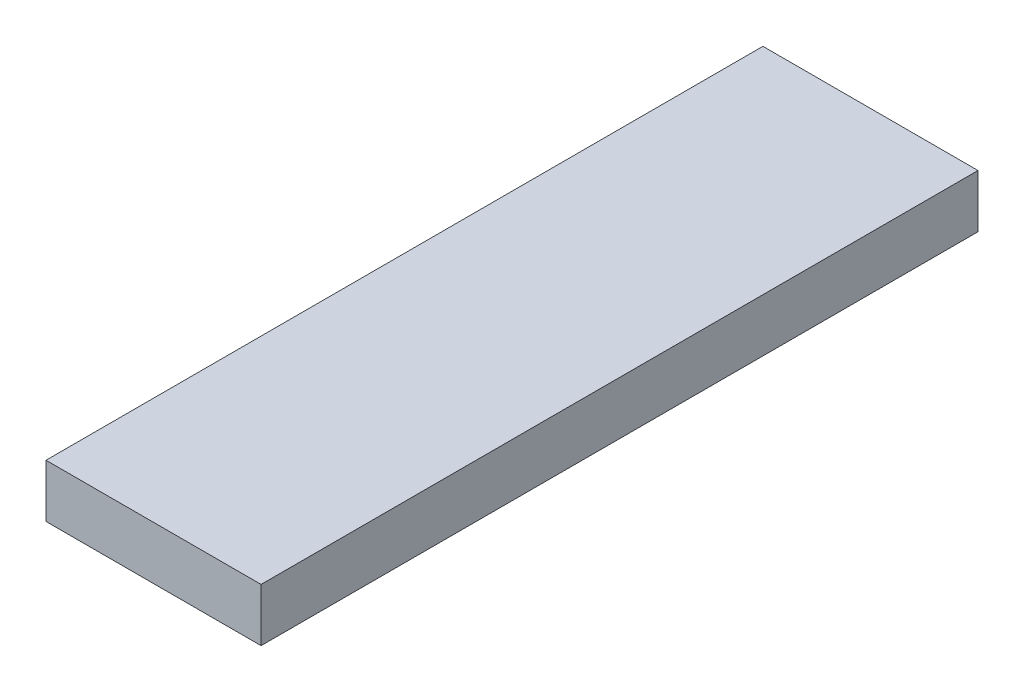
ISO-10303-21;
HEADER;
FILE_DESCRIPTION(('STEP AP214'),'2;1');
FILE_NAME('part.step','',(''),(''),'','','');
FILE_SCHEMA(('AUTOMOTIVE_DESIGN { 1 0 10303 214 1 1 1 1 }'));
ENDSEC;
DATA;
#1=APPLICATION_CONTEXT('core data for automotive mechanical design processes');
#2=APPLICATION_PROTOCOL_DEFINITION('international standard','automotive_design',2000,#1);
#3=PRODUCT_CONTEXT('',#1,'mechanical');
#4=PRODUCT('Part','Part','',(#3));
#5=PRODUCT_RELATED_PRODUCT_CATEGORY('part','',(#4));
#6=PRODUCT_DEFINITION_FORMATION('','',#4);
#7=PRODUCT_DEFINITION_CONTEXT('part definition',#1,'design');
#8=PRODUCT_DEFINITION('design','',#6,#7);
#9=PRODUCT_DEFINITION_SHAPE('','',#8);
#10=(LENGTH_UNIT() NAMED_UNIT(*) SI_UNIT(.MILLI.,.METRE.));
#11=(NAMED_UNIT(*) PLANE_ANGLE_UNIT() SI_UNIT($,.RADIAN.));
#12=(NAMED_UNIT(*) SI_UNIT($,.STERADIAN.) SOLID_ANGLE_UNIT());
#13=UNCERTAINTY_MEASURE_WITH_UNIT(LENGTH_MEASURE(1.E-05),#10,'distance_accuracy_value','');
#14=(GEOMETRIC_REPRESENTATION_CONTEXT(3) GLOBAL_UNCERTAINTY_ASSIGNED_CONTEXT((#13)) GLOBAL_UNIT_ASSIGNED_CONTEXT((#10,
#11,#12)) REPRESENTATION_CONTEXT('',''));
#15=CARTESIAN_POINT('',(0.,0.,0.));
#16=DIRECTION('',(0.,0.,1.));
#17=DIRECTION('',(1.,0.,0.));
#18=AXIS2_PLACEMENT_3D('',#15,#16,#17);
#19=CARTESIAN_POINT('',(0.,4.699,-63.5));
#20=DIRECTION('',(1.,0.,0.));
#21=DIRECTION('',(0.,0.,-1.));
#22=AXIS2_PLACEMENT_3D('',#19,#20,#21);
#23=PLANE('',#22);
#24=DIRECTION('',(0.,0.,1.));
#25=VECTOR('',#24,1.);
#26=CARTESIAN_POINT('',(0.,0.,-63.5));
#27=LINE('',#26,#25);
#28=CARTESIAN_POINT('',(0.,0.,-63.5));
#29=VERTEX_POINT('',#28);
#30=CARTESIAN_POINT('',(0.,0.,0.));
#31=VERTEX_POINT('',#30);
#32=EDGE_CURVE('E96',#29,#31,#27,.T.);
#33=ORIENTED_EDGE('',*,*,#32,.T.);
#34=DIRECTION('',(0.,-1.,0.));
#35=VECTOR('',#34,1.);
#36=CARTESIAN_POINT('',(0.,4.699,0.));
#37=LINE('',#36,#35);
#38=CARTESIAN_POINT('',(0.,4.699,0.));
#39=VERTEX_POINT('',#38);
#40=EDGE_CURVE('E11',#39,#31,#37,.T.);
#41=ORIENTED_EDGE('',*,*,#40,.F.);
#42=DIRECTION('',(0.,0.,1.));
#43=VECTOR('',#42,1.);
#44=CARTESIAN_POINT('',(0.,4.699,-63.5));
#45=LINE('',#44,#43);
#46=CARTESIAN_POINT('',(0.,4.699,-63.5));
#47=VERTEX_POINT('',#46);
#48=EDGE_CURVE('E84',#47,#39,#45,.T.);
#49=ORIENTED_EDGE('',*,*,#48,.F.);
#50=DIRECTION('',(0.,-1.,0.));
#51=VECTOR('',#50,1.);
#52=CARTESIAN_POINT('',(0.,4.699,-63.5));
#53=LINE('',#52,#51);
#54=EDGE_CURVE('E92',#47,#29,#53,.T.);
#55=ORIENTED_EDGE('',*,*,#54,.T.);
#56=EDGE_LOOP('',(#33,#41,#49,#55));
#57=FACE_BOUND('',#56,.T.);
#58=ADVANCED_FACE('F33',(#57),#23,.F.);
#59=CARTESIAN_POINT('',(0.,4.699,0.));
#60=DIRECTION('',(0.,0.,-1.));
#61=DIRECTION('',(-1.,0.,0.));
#62=AXIS2_PLACEMENT_3D('',#59,#60,#61);
#63=PLANE('',#62);
#64=DIRECTION('',(1.,0.,0.));
#65=VECTOR('',#64,1.);
#66=CARTESIAN_POINT('',(0.,0.,0.));
#67=LINE('',#66,#65);
#68=CARTESIAN_POINT('',(19.05,0.,0.));
#69=VERTEX_POINT('',#68);
#70=EDGE_CURVE('E88',#31,#69,#67,.T.);
#71=ORIENTED_EDGE('',*,*,#70,.T.);
#72=DIRECTION('',(0.,-1.,0.));
#73=VECTOR('',#72,1.);
#74=CARTESIAN_POINT('',(19.05,4.699,0.));
#75=LINE('',#74,#73);
#76=CARTESIAN_POINT('',(19.05,4.699,0.));
#77=VERTEX_POINT('',#76);
#78=EDGE_CURVE('E41',#77,#69,#75,.T.);
#79=ORIENTED_EDGE('',*,*,#78,.F.);
#80=DIRECTION('',(1.,0.,0.));
#81=VECTOR('',#80,1.);
#82=CARTESIAN_POINT('',(0.,4.699,0.));
#83=LINE('',#82,#81);
#84=EDGE_CURVE('E79',#39,#77,#83,.T.);
#85=ORIENTED_EDGE('',*,*,#84,.F.);
#86=ORIENTED_EDGE('',*,*,#40,.T.);
#87=EDGE_LOOP('',(#71,#79,#85,#86));
#88=FACE_BOUND('',#87,.T.);
#89=ADVANCED_FACE('F87',(#88),#63,.F.);
#90=CARTESIAN_POINT('',(19.05,4.699,0.));
#91=DIRECTION('',(-1.,0.,0.));
#92=DIRECTION('',(0.,0.,1.));
#93=AXIS2_PLACEMENT_3D('',#90,#91,#92);
#94=PLANE('',#93);
#95=DIRECTION('',(0.,0.,-1.));
#96=VECTOR('',#95,1.);
#97=CARTESIAN_POINT('',(19.05,0.,0.));
#98=LINE('',#97,#96);
#99=CARTESIAN_POINT('',(19.05,0.,-63.5));
#100=VERTEX_POINT('',#99);
#101=EDGE_CURVE('E66',#69,#100,#98,.T.);
#102=ORIENTED_EDGE('',*,*,#101,.T.);
#103=DIRECTION('',(0.,-1.,0.));
#104=VECTOR('',#103,1.);
#105=CARTESIAN_POINT('',(19.05,4.699,-63.5));
#106=LINE('',#105,#104);
#107=CARTESIAN_POINT('',(19.05,4.699,-63.5));
#108=VERTEX_POINT('',#107);
#109=EDGE_CURVE('E89',#108,#100,#106,.T.);
#110=ORIENTED_EDGE('',*,*,#109,.F.);
#111=DIRECTION('',(0.,0.,-1.));
#112=VECTOR('',#111,1.);
#113=CARTESIAN_POINT('',(19.05,4.699,0.));
#114=LINE('',#113,#112);
#115=EDGE_CURVE('E82',#77,#108,#114,.T.);
#116=ORIENTED_EDGE('',*,*,#115,.F.);
#117=ORIENTED_EDGE('',*,*,#78,.T.);
#118=EDGE_LOOP('',(#102,#110,#116,#117));
#119=FACE_BOUND('',#118,.T.);
#120=ADVANCED_FACE('F90',(#119),#94,.F.);
#121=CARTESIAN_POINT('',(19.05,4.699,-63.5));
#122=DIRECTION('',(0.,0.,1.));
#123=DIRECTION('',(1.,0.,0.));
#124=AXIS2_PLACEMENT_3D('',#121,#122,#123);
#125=PLANE('',#124);
#126=DIRECTION('',(-1.,0.,0.));
#127=VECTOR('',#126,1.);
#128=CARTESIAN_POINT('',(19.05,0.,-63.5));
#129=LINE('',#128,#127);
#130=EDGE_CURVE('E72',#100,#29,#129,.T.);
#131=ORIENTED_EDGE('',*,*,#130,.T.);
#132=ORIENTED_EDGE('',*,*,#54,.F.);
#133=DIRECTION('',(-1.,0.,0.));
#134=VECTOR('',#133,1.);
#135=CARTESIAN_POINT('',(19.05,4.699,-63.5));
#136=LINE('',#135,#134);
#137=EDGE_CURVE('E49',#108,#47,#136,.T.);
#138=ORIENTED_EDGE('',*,*,#137,.F.);
#139=ORIENTED_EDGE('',*,*,#109,.T.);
#140=EDGE_LOOP('',(#131,#132,#138,#139));
#141=FACE_BOUND('',#140,.T.);
#142=ADVANCED_FACE('F103',(#141),#125,.F.);
#143=CARTESIAN_POINT('',(0.,4.699,0.));
#144=DIRECTION('',(0.,1.,0.));
#145=DIRECTION('',(0.,0.,1.));
#146=AXIS2_PLACEMENT_3D('',#143,#144,#145);
#147=PLANE('',#146);
#148=ORIENTED_EDGE('',*,*,#48,.T.);
#149=ORIENTED_EDGE('',*,*,#84,.T.);
#150=ORIENTED_EDGE('',*,*,#115,.T.);
#151=ORIENTED_EDGE('',*,*,#137,.T.);
#152=EDGE_LOOP('',(#148,#149,#150,#151));
#153=FACE_BOUND('',#152,.T.);
#154=ADVANCED_FACE('F80',(#153),#147,.T.);
#155=CARTESIAN_POINT('',(0.,0.,0.));
#156=DIRECTION('',(0.,1.,0.));
#157=DIRECTION('',(0.,0.,1.));
#158=AXIS2_PLACEMENT_3D('',#155,#156,#157);
#159=PLANE('',#158);
#160=ORIENTED_EDGE('',*,*,#32,.F.);
#161=ORIENTED_EDGE('',*,*,#130,.F.);
#162=ORIENTED_EDGE('',*,*,#101,.F.);
#163=ORIENTED_EDGE('',*,*,#70,.F.);
#164=EDGE_LOOP('',(#160,#161,#162,#163));
#165=FACE_BOUND('',#164,.T.);
#166=ADVANCED_FACE('F106',(#165),#159,.F.);
#167=CLOSED_SHELL('',(#58,#89,#120,#142,#154,#166));
#168=MANIFOLD_SOLID_BREP('B2',#167);
#169=ADVANCED_BREP_SHAPE_REPRESENTATION('',(#18,#168),#14);
#170=SHAPE_DEFINITION_REPRESENTATION(#9,#169);
ENDSEC;
END-ISO-10303-21;
